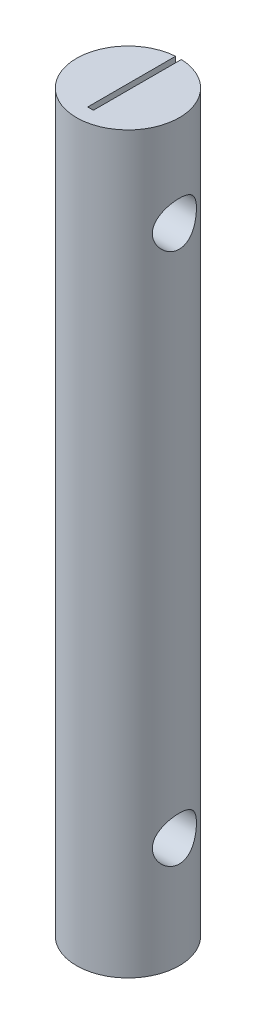
ISO-10303-21;
HEADER;
FILE_DESCRIPTION(('STEP AP214'),'2;1');
FILE_NAME('part.step','',(''),(''),'','','');
FILE_SCHEMA(('AUTOMOTIVE_DESIGN { 1 0 10303 214 1 1 1 1 }'));
ENDSEC;
DATA;
#1=APPLICATION_CONTEXT('core data for automotive mechanical design processes');
#2=APPLICATION_PROTOCOL_DEFINITION('international standard','automotive_design',2000,#1);
#3=PRODUCT_CONTEXT('',#1,'mechanical');
#4=PRODUCT('Part','Part','',(#3));
#5=PRODUCT_RELATED_PRODUCT_CATEGORY('part','',(#4));
#6=PRODUCT_DEFINITION_FORMATION('','',#4);
#7=PRODUCT_DEFINITION_CONTEXT('part definition',#1,'design');
#8=PRODUCT_DEFINITION('design','',#6,#7);
#9=PRODUCT_DEFINITION_SHAPE('','',#8);
#10=(LENGTH_UNIT() NAMED_UNIT(*) SI_UNIT(.MILLI.,.METRE.));
#11=(NAMED_UNIT(*) PLANE_ANGLE_UNIT() SI_UNIT($,.RADIAN.));
#12=(NAMED_UNIT(*) SI_UNIT($,.STERADIAN.) SOLID_ANGLE_UNIT());
#13=UNCERTAINTY_MEASURE_WITH_UNIT(LENGTH_MEASURE(1.E-05),#10,'distance_accuracy_value','');
#14=(GEOMETRIC_REPRESENTATION_CONTEXT(3) GLOBAL_UNCERTAINTY_ASSIGNED_CONTEXT((#13)) GLOBAL_UNIT_ASSIGNED_CONTEXT((#10,
#11,#12)) REPRESENTATION_CONTEXT('',''));
#15=CARTESIAN_POINT('',(0.,0.,0.));
#16=DIRECTION('',(0.,0.,1.));
#17=DIRECTION('',(1.,0.,0.));
#18=AXIS2_PLACEMENT_3D('',#15,#16,#17);
#19=CARTESIAN_POINT('',(0.,100.,0.));
#20=DIRECTION('',(0.,-1.,0.));
#21=DIRECTION('',(0.,0.,-1.));
#22=AXIS2_PLACEMENT_3D('',#19,#20,#21);
#23=CYLINDRICAL_SURFACE('',#22,7.);
#24=CARTESIAN_POINT('',(0.,100.,0.));
#25=DIRECTION('',(0.,1.,0.));
#26=DIRECTION('',(0.,0.,1.));
#27=AXIS2_PLACEMENT_3D('',#24,#25,#26);
#28=CIRCLE('',#27,7.);
#29=CARTESIAN_POINT('',(-0.499999999999999,100.,-6.98212002188447));
#30=VERTEX_POINT('',#29);
#31=CARTESIAN_POINT('',(0.27608075124194,100.,-6.99455355392992));
#32=VERTEX_POINT('',#31);
#33=EDGE_CURVE('E105',#30,#32,#28,.T.);
#34=ORIENTED_EDGE('',*,*,#33,.F.);
#35=DIRECTION('',(0.,-1.,0.));
#36=VECTOR('',#35,1.);
#37=CARTESIAN_POINT('',(-0.499999999999999,100.,-6.98212002188447));
#38=LINE('',#37,#36);
#39=CARTESIAN_POINT('',(-0.499999999999999,60.,-6.98212002188447));
#40=VERTEX_POINT('',#39);
#41=EDGE_CURVE('E102',#30,#40,#38,.T.);
#42=ORIENTED_EDGE('',*,*,#41,.T.);
#43=CARTESIAN_POINT('',(0.,60.,0.));
#44=DIRECTION('',(0.,1.,0.));
#45=DIRECTION('',(0.,0.,1.));
#46=AXIS2_PLACEMENT_3D('',#43,#44,#45);
#47=CIRCLE('',#46,7.);
#48=CARTESIAN_POINT('',(0.27608075124194,60.,-6.99455355392992));
#49=VERTEX_POINT('',#48);
#50=EDGE_CURVE('E11',#49,#40,#47,.T.);
#51=ORIENTED_EDGE('',*,*,#50,.F.);
#52=DIRECTION('',(0.,-1.,0.));
#53=VECTOR('',#52,1.);
#54=CARTESIAN_POINT('',(0.27608075124194,100.,-6.99455355392992));
#55=LINE('',#54,#53);
#56=EDGE_CURVE('E98',#49,#32,#55,.F.);
#57=ORIENTED_EDGE('',*,*,#56,.T.);
#58=EDGE_LOOP('',(#34,#42,#51,#57));
#59=FACE_BOUND('',#58,.T.);
#60=CARTESIAN_POINT('',(0.,0.,0.));
#61=DIRECTION('',(0.,1.,0.));
#62=DIRECTION('',(0.,0.,1.));
#63=AXIS2_PLACEMENT_3D('',#60,#61,#62);
#64=CIRCLE('',#63,7.);
#65=CARTESIAN_POINT('',(0.,0.,7.));
#66=VERTEX_POINT('',#65);
#67=EDGE_CURVE('E104',#66,#66,#64,.T.);
#68=ORIENTED_EDGE('',*,*,#67,.T.);
#69=EDGE_LOOP('',(#68));
#70=FACE_BOUND('',#69,.T.);
#71=CARTESIAN_POINT('',(-6.32326286388966,15.,3.00272322303504));
#72=CARTESIAN_POINT('',(-6.32326378315434,15.0797912896545,3.00272226818639));
#73=CARTESIAN_POINT('',(-6.32478146533273,15.1596118809787,2.99953311878725));
#74=CARTESIAN_POINT('',(-6.33079257859421,15.3186489963649,2.98682183299326));
#75=CARTESIAN_POINT('',(-6.33528790539103,15.3978651030629,2.97729566212505));
#76=CARTESIAN_POINT('',(-6.3530650917198,15.6340131467418,2.93928786779487));
#77=CARTESIAN_POINT('',(-6.37063756968942,15.7892250157486,2.90137729599567));
#78=CARTESIAN_POINT('',(-6.4148385436042,16.0897370264084,2.8022707548614));
#79=CARTESIAN_POINT('',(-6.44142856736231,16.2350761780639,2.74117357847268));
#80=CARTESIAN_POINT('',(-6.500603693556,16.5134371194853,2.59772153198398));
#81=CARTESIAN_POINT('',(-6.5331876198883,16.6464613179654,2.5153708309034));
#82=CARTESIAN_POINT('',(-6.60308877829957,16.9052311786623,2.32593830900264));
#83=CARTESIAN_POINT('',(-6.64057262682859,17.0300634835517,2.21767051747863));
#84=CARTESIAN_POINT('',(-6.71469078358872,17.2604816202512,1.98196508960753));
#85=CARTESIAN_POINT('',(-6.7513247470996,17.3660597575485,1.8545198263684));
#86=CARTESIAN_POINT('',(-6.82166586264291,17.5597335426098,1.57680138342897));
#87=CARTESIAN_POINT('',(-6.85515750379873,17.6467870960987,1.4257419236761));
#88=CARTESIAN_POINT('',(-6.91339082241381,17.7938478518043,1.10942612751776));
#89=CARTESIAN_POINT('',(-6.93813659272704,17.8538677087488,0.944176476898538));
#90=CARTESIAN_POINT('',(-6.97491347834318,17.9418124036036,0.61374680879481));
#91=CARTESIAN_POINT('',(-6.9875654805161,17.9713118175719,0.449056411400292));
#92=CARTESIAN_POINT('',(-7.00100203651558,18.0024770344066,0.116610327718632));
#93=CARTESIAN_POINT('',(-7.00179171329503,18.0041548525487,-0.0511440040136647));
#94=CARTESIAN_POINT('',(-6.99177277513283,17.9804249911638,-0.373428597075082));
#95=CARTESIAN_POINT('',(-6.98170819836005,17.956755554903,-0.528114471296276));
#96=CARTESIAN_POINT('',(-6.95215731198996,17.8859983254415,-0.831073500655528));
#97=CARTESIAN_POINT('',(-6.93267031115006,17.8389088141032,-0.979346184443139));
#98=CARTESIAN_POINT('',(-6.88577735894948,17.7221150794459,-1.26798767380358));
#99=CARTESIAN_POINT('',(-6.85825583387804,17.6520788364832,-1.40820257797709));
#100=CARTESIAN_POINT('',(-6.79796108187211,17.4917177145317,-1.67525969213018));
#101=CARTESIAN_POINT('',(-6.76518597214793,17.4013855571745,-1.80209708072876));
#102=CARTESIAN_POINT('',(-6.69479048985917,17.1952476046488,-2.04876226096162));
#103=CARTESIAN_POINT('',(-6.65699104415712,17.0780528434205,-2.16737980999052));
#104=CARTESIAN_POINT('',(-6.58259238611411,16.8254025458965,-2.38382119963024));
#105=CARTESIAN_POINT('',(-6.54599369712514,16.6899391752697,-2.4816360725643));
#106=CARTESIAN_POINT('',(-6.47682120801458,16.3983816856667,-2.65707048589437));
#107=CARTESIAN_POINT('',(-6.44444316942739,16.241714863924,-2.73382219709668));
#108=CARTESIAN_POINT('',(-6.38974480684829,15.9159286768116,-2.85935390433064));
#109=CARTESIAN_POINT('',(-6.36741683466148,15.7468188950728,-2.90815517863915));
#110=CARTESIAN_POINT('',(-6.3372798087362,15.4130765360986,-2.97322966393146));
#111=CARTESIAN_POINT('',(-6.32859493106654,15.2489083212291,-2.99147059646765));
#112=CARTESIAN_POINT('',(-6.32421968898995,14.9196619929362,-3.00071449565785));
#113=CARTESIAN_POINT('',(-6.32852438110462,14.7545842495233,-2.99172782439506));
#114=CARTESIAN_POINT('',(-6.34873302314869,14.4402859046611,-2.9485713391566));
#115=CARTESIAN_POINT('',(-6.3638118925518,14.2907595210896,-2.91619112946264));
#116=CARTESIAN_POINT('',(-6.40279141976494,13.999403516592,-2.82957599799855));
#117=CARTESIAN_POINT('',(-6.42669421850103,13.8575757731533,-2.77533577209872));
#118=CARTESIAN_POINT('',(-6.48188552590026,13.5787537793978,-2.64394242194293));
#119=CARTESIAN_POINT('',(-6.51344947941061,13.4422362094036,-2.56589729149866));
#120=CARTESIAN_POINT('',(-6.58003337440752,13.1835557673391,-2.38997869042985));
#121=CARTESIAN_POINT('',(-6.61505486533699,13.0613993852311,-2.29209630916704));
#122=CARTESIAN_POINT('',(-6.68827581588288,12.8238514691411,-2.06926631665099));
#123=CARTESIAN_POINT('',(-6.72648697354915,12.7099702661524,-1.94270591066993));
#124=CARTESIAN_POINT('',(-6.79897677450606,12.5047636212234,-1.67140952707088));
#125=CARTESIAN_POINT('',(-6.83325502815704,12.4134404131117,-1.52667175155937));
#126=CARTESIAN_POINT('',(-6.89432479209561,12.2558485112159,-1.22170095280638));
#127=CARTESIAN_POINT('',(-6.92107958727478,12.1897021465899,-1.06139690704243));
#128=CARTESIAN_POINT('',(-6.96377353791193,12.0858242717744,-0.73048863357864));
#129=CARTESIAN_POINT('',(-6.97971953966757,12.0480747733224,-0.559891000567304));
#130=CARTESIAN_POINT('',(-6.99817059776532,12.00441996817,-0.226711607260602));
#131=CARTESIAN_POINT('',(-7.00157374116683,11.996386761269,-0.0644566574853799));
#132=CARTESIAN_POINT('',(-6.997073869522,12.0065952376713,0.259046171665985));
#133=CARTESIAN_POINT('',(-6.9891730366938,12.0248318496243,0.420294239384294));
#134=CARTESIAN_POINT('',(-6.963434090249,12.0855369016493,0.730700780154835));
#135=CARTESIAN_POINT('',(-6.94599561815234,12.1270323913988,0.880085485827085));
#136=CARTESIAN_POINT('',(-6.90313487728844,12.2319824279208,1.1696912163942));
#137=CARTESIAN_POINT('',(-6.87771113609789,12.2954410247446,1.30991054549742));
#138=CARTESIAN_POINT('',(-6.81986821037176,12.4457391720343,1.58428371030018));
#139=CARTESIAN_POINT('',(-6.78718225099332,12.5335153780417,1.7178667771632));
#140=CARTESIAN_POINT('',(-6.71863505514397,12.7286336383767,1.96898810440127));
#141=CARTESIAN_POINT('',(-6.68277256320433,12.8359834467305,2.08651997375304));
#142=CARTESIAN_POINT('',(-6.60861837374977,13.0763507883284,2.31109260863649));
#143=CARTESIAN_POINT('',(-6.57033953914823,13.2106667101791,2.41675024864069));
#144=CARTESIAN_POINT('',(-6.49828904456149,13.4963533256694,2.60430013882765));
#145=CARTESIAN_POINT('',(-6.46452001206481,13.6477338675645,2.68617856717813));
#146=CARTESIAN_POINT('',(-6.42053526852075,13.8844307784929,2.7889251642932));
#147=CARTESIAN_POINT('',(-6.40698833087529,13.9649075867447,2.81982236673246));
#148=CARTESIAN_POINT('',(-6.38257011545701,14.1285759441178,2.87466573554698));
#149=CARTESIAN_POINT('',(-6.37169751453675,14.2117661276083,2.89861534035282));
#150=CARTESIAN_POINT('',(-6.35306374282358,14.3800043271867,2.93923109000154));
#151=CARTESIAN_POINT('',(-6.34529437526487,14.4650468148595,2.95591643304358));
#152=CARTESIAN_POINT('',(-6.33313829294579,14.6364516699032,2.9818731454383));
#153=CARTESIAN_POINT('',(-6.32874898440049,14.7228129732355,2.99115019995573));
#154=CARTESIAN_POINT('',(-6.32517996467578,14.8411445195379,2.99868324610555));
#155=CARTESIAN_POINT('',(-6.32446164184328,14.8728908029643,3.00019769857171));
#156=CARTESIAN_POINT('',(-6.32350290448429,14.9364231733768,3.00221788535343));
#157=CARTESIAN_POINT('',(-6.32326249763284,14.968209260994,3.00272360346935));
#158=CARTESIAN_POINT('',(-6.32326286388966,15.,3.00272322303504));
#159=B_SPLINE_CURVE_WITH_KNOTS('',3,(#71,#72,#73,#74,#75,#76,#77,#78,#79,#80,#81,#82,#83,#84,
#85,#86,#87,#88,#89,#90,#91,#92,#93,#94,#95,#96,#97,#98,#99,#100,#101,#102,#103,#104,#105,#106,
#107,#108,#109,#110,#111,#112,#113,#114,#115,#116,#117,#118,#119,#120,#121,#122,#123,#124,#125,
#126,#127,#128,#129,#130,#131,#132,#133,#134,#135,#136,#137,#138,#139,#140,#141,#142,#143,#144,
#145,#146,#147,#148,#149,#150,#151,#152,#153,#154,#155,#156,#157,#158),.UNSPECIFIED.,.T.,.F.,(4,
2,2,2,2,2,2,2,2,2,2,2,2,2,2,2,2,2,2,2,2,2,2,2,2,2,2,2,2,2,2,2,2,2,2,2,2,2,2,2,2,2,2,4),(0.,
0.239338244887283,0.478829010811593,0.958460945018812,1.43607181036892,1.91358906030128,
2.4197112565315,2.92603527246616,3.45591952851075,3.98555548229669,4.48625015142358,
4.98672858057274,5.45495951464113,5.92322480401723,6.39858906115766,6.87412406271998,
7.38479275075876,7.89568113508067,8.42522415338773,8.95436350031238,9.44789955511443,
9.94124780715423,10.4003836153743,10.8596308957659,11.3388032299623,11.8181912811821,
12.3392379542931,12.8603362039152,13.3839349896902,13.9072018169267,14.3921818903264,
14.8770683515757,15.3430410061853,15.8090996331255,16.2964751312754,16.7840441229666,
17.3070458065871,17.8303508829182,18.0918408955747,18.3532012727434,18.6138666631023,
18.8743318245369,18.9696883167252,19.0650463402678),.UNSPECIFIED.);
#160=CARTESIAN_POINT('',(-6.32326286388966,15.,3.00272322303504));
#161=VERTEX_POINT('',#160);
#162=EDGE_CURVE('E111',#161,#161,#159,.T.);
#163=ORIENTED_EDGE('',*,*,#162,.F.);
#164=EDGE_LOOP('',(#163));
#165=FACE_BOUND('',#164,.T.);
#166=CARTESIAN_POINT('',(6.32326286388966,15.,3.00272322303504));
#167=CARTESIAN_POINT('',(6.32326378315434,14.9202087103455,3.00272226818639));
#168=CARTESIAN_POINT('',(6.32478146533273,14.8403881190213,2.99953311878725));
#169=CARTESIAN_POINT('',(6.33079257859421,14.6813510036351,2.98682183299326));
#170=CARTESIAN_POINT('',(6.33528790539103,14.6021348969371,2.97729566212505));
#171=CARTESIAN_POINT('',(6.3530650917198,14.3659868532581,2.93928786779487));
#172=CARTESIAN_POINT('',(6.37063756968942,14.2107749842514,2.90137729599567));
#173=CARTESIAN_POINT('',(6.4148385436042,13.9102629735916,2.8022707548614));
#174=CARTESIAN_POINT('',(6.44142856736231,13.764923821936,2.74117357847268));
#175=CARTESIAN_POINT('',(6.500603693556,13.4865628805147,2.59772153198398));
#176=CARTESIAN_POINT('',(6.5331876198883,13.3535386820346,2.5153708309034));
#177=CARTESIAN_POINT('',(6.60308877829957,13.0947688213377,2.32593830900264));
#178=CARTESIAN_POINT('',(6.64057262682859,12.9699365164483,2.21767051747863));
#179=CARTESIAN_POINT('',(6.71469078358872,12.7395183797488,1.98196508960753));
#180=CARTESIAN_POINT('',(6.7513247470996,12.6339402424515,1.8545198263684));
#181=CARTESIAN_POINT('',(6.82166586264291,12.4402664573902,1.57680138342897));
#182=CARTESIAN_POINT('',(6.85515750379873,12.3532129039013,1.4257419236761));
#183=CARTESIAN_POINT('',(6.91339082241381,12.2061521481957,1.10942612751776));
#184=CARTESIAN_POINT('',(6.93813659272704,12.1461322912512,0.944176476898537));
#185=CARTESIAN_POINT('',(6.97491347834318,12.0581875963964,0.613746808794809));
#186=CARTESIAN_POINT('',(6.9875654805161,12.0286881824281,0.449056411400291));
#187=CARTESIAN_POINT('',(7.00100203651558,11.9975229655934,0.116610327718632));
#188=CARTESIAN_POINT('',(7.00179171329503,11.9958451474513,-0.051144004013664));
#189=CARTESIAN_POINT('',(6.99177277513283,12.0195750088362,-0.373428597075081));
#190=CARTESIAN_POINT('',(6.98170819836005,12.043244445097,-0.528114471296275));
#191=CARTESIAN_POINT('',(6.95215731198996,12.1140016745585,-0.831073500655528));
#192=CARTESIAN_POINT('',(6.93267031115006,12.1610911858968,-0.979346184443139));
#193=CARTESIAN_POINT('',(6.88577735894948,12.2778849205541,-1.26798767380358));
#194=CARTESIAN_POINT('',(6.85825583387804,12.3479211635168,-1.40820257797709));
#195=CARTESIAN_POINT('',(6.79796108187211,12.5082822854683,-1.67525969213018));
#196=CARTESIAN_POINT('',(6.76518597214793,12.5986144428255,-1.80209708072876));
#197=CARTESIAN_POINT('',(6.69479048985917,12.8047523953512,-2.04876226096162));
#198=CARTESIAN_POINT('',(6.65699104415712,12.9219471565795,-2.16737980999052));
#199=CARTESIAN_POINT('',(6.58259238611411,13.1745974541035,-2.38382119963024));
#200=CARTESIAN_POINT('',(6.54599369712514,13.3100608247303,-2.4816360725643));
#201=CARTESIAN_POINT('',(6.47682120801458,13.6016183143333,-2.65707048589437));
#202=CARTESIAN_POINT('',(6.44444316942739,13.758285136076,-2.73382219709669));
#203=CARTESIAN_POINT('',(6.38974480684829,14.0840713231884,-2.85935390433064));
#204=CARTESIAN_POINT('',(6.36741683466148,14.2531811049272,-2.90815517863915));
#205=CARTESIAN_POINT('',(6.3372798087362,14.5869234639014,-2.97322966393146));
#206=CARTESIAN_POINT('',(6.32859493106654,14.7510916787709,-2.99147059646765));
#207=CARTESIAN_POINT('',(6.32421968898995,15.0803380070638,-3.00071449565785));
#208=CARTESIAN_POINT('',(6.32852438110462,15.2454157504767,-2.99172782439506));
#209=CARTESIAN_POINT('',(6.34873302314869,15.5597140953389,-2.9485713391566));
#210=CARTESIAN_POINT('',(6.3638118925518,15.7092404789104,-2.91619112946264));
#211=CARTESIAN_POINT('',(6.40279141976494,16.0005964834079,-2.82957599799855));
#212=CARTESIAN_POINT('',(6.42669421850103,16.1424242268467,-2.77533577209872));
#213=CARTESIAN_POINT('',(6.48188552590026,16.4212462206022,-2.64394242194293));
#214=CARTESIAN_POINT('',(6.51344947941061,16.5577637905964,-2.56589729149866));
#215=CARTESIAN_POINT('',(6.58003337440752,16.8164442326609,-2.38997869042984));
#216=CARTESIAN_POINT('',(6.61505486533699,16.9386006147689,-2.29209630916704));
#217=CARTESIAN_POINT('',(6.68827581588288,17.1761485308589,-2.06926631665099));
#218=CARTESIAN_POINT('',(6.72648697354915,17.2900297338476,-1.94270591066993));
#219=CARTESIAN_POINT('',(6.79897677450606,17.4952363787766,-1.67140952707088));
#220=CARTESIAN_POINT('',(6.83325502815704,17.5865595868883,-1.52667175155937));
#221=CARTESIAN_POINT('',(6.89432479209561,17.7441514887841,-1.22170095280638));
#222=CARTESIAN_POINT('',(6.92107958727478,17.8102978534101,-1.06139690704243));
#223=CARTESIAN_POINT('',(6.96377353791193,17.9141757282256,-0.73048863357864));
#224=CARTESIAN_POINT('',(6.97971953966757,17.9519252266776,-0.559891000567304));
#225=CARTESIAN_POINT('',(6.99817059776532,17.99558003183,-0.226711607260602));
#226=CARTESIAN_POINT('',(7.00157374116683,18.003613238731,-0.0644566574853802));
#227=CARTESIAN_POINT('',(6.997073869522,17.9934047623287,0.259046171665984));
#228=CARTESIAN_POINT('',(6.9891730366938,17.9751681503757,0.420294239384293));
#229=CARTESIAN_POINT('',(6.963434090249,17.9144630983507,0.730700780154835));
#230=CARTESIAN_POINT('',(6.94599561815234,17.8729676086012,0.880085485827085));
#231=CARTESIAN_POINT('',(6.90313487728844,17.7680175720792,1.1696912163942));
#232=CARTESIAN_POINT('',(6.87771113609789,17.7045589752554,1.30991054549742));
#233=CARTESIAN_POINT('',(6.81986821037176,17.5542608279657,1.58428371030018));
#234=CARTESIAN_POINT('',(6.78718225099332,17.4664846219583,1.7178667771632));
#235=CARTESIAN_POINT('',(6.71863505514397,17.2713663616233,1.96898810440127));
#236=CARTESIAN_POINT('',(6.68277256320433,17.1640165532695,2.08651997375304));
#237=CARTESIAN_POINT('',(6.60861837374977,16.9236492116716,2.31109260863649));
#238=CARTESIAN_POINT('',(6.57033953914823,16.7893332898209,2.41675024864069));
#239=CARTESIAN_POINT('',(6.4982890445615,16.5036466743306,2.60430013882765));
#240=CARTESIAN_POINT('',(6.46452001206481,16.3522661324355,2.68617856717813));
#241=CARTESIAN_POINT('',(6.42053526852075,16.1155692215071,2.7889251642932));
#242=CARTESIAN_POINT('',(6.40698833087529,16.0350924132553,2.81982236673246));
#243=CARTESIAN_POINT('',(6.38257011545701,15.8714240558822,2.87466573554698));
#244=CARTESIAN_POINT('',(6.37169751453675,15.7882338723917,2.89861534035282));
#245=CARTESIAN_POINT('',(6.35306374282358,15.6199956728133,2.93923109000154));
#246=CARTESIAN_POINT('',(6.34529437526487,15.5349531851405,2.95591643304358));
#247=CARTESIAN_POINT('',(6.33313829294579,15.3635483300968,2.9818731454383));
#248=CARTESIAN_POINT('',(6.32874898440049,15.2771870267645,2.99115019995573));
#249=CARTESIAN_POINT('',(6.32517996467578,15.1588554804621,2.99868324610555));
#250=CARTESIAN_POINT('',(6.32446164184328,15.1271091970357,3.00019769857171));
#251=CARTESIAN_POINT('',(6.32350290448429,15.0635768266232,3.00221788535343));
#252=CARTESIAN_POINT('',(6.32326249763284,15.031790739006,3.00272360346935));
#253=CARTESIAN_POINT('',(6.32326286388966,15.,3.00272322303504));
#254=B_SPLINE_CURVE_WITH_KNOTS('',3,(#166,#167,#168,#169,#170,#171,#172,#173,#174,#175,#176,
#177,#178,#179,#180,#181,#182,#183,#184,#185,#186,#187,#188,#189,#190,#191,#192,#193,#194,#195,
#196,#197,#198,#199,#200,#201,#202,#203,#204,#205,#206,#207,#208,#209,#210,#211,#212,#213,#214,
#215,#216,#217,#218,#219,#220,#221,#222,#223,#224,#225,#226,#227,#228,#229,#230,#231,#232,#233,
#234,#235,#236,#237,#238,#239,#240,#241,#242,#243,#244,#245,#246,#247,#248,#249,#250,#251,#252,
#253),.UNSPECIFIED.,.T.,.F.,(4,2,2,2,2,2,2,2,2,2,2,2,2,2,2,2,2,2,2,2,2,2,2,2,2,2,2,2,2,2,2,2,2,
2,2,2,2,2,2,2,2,2,2,4),(0.,0.239338244887283,0.478829010811593,0.958460945018812,
1.43607181036892,1.91358906030127,2.4197112565315,2.92603527246616,3.45591952851075,
3.98555548229669,4.48625015142358,4.98672858057274,5.45495951464113,5.92322480401723,
6.39858906115766,6.87412406271998,7.38479275075876,7.89568113508067,8.42522415338774,
8.95436350031238,9.44789955511443,9.94124780715423,10.4003836153743,10.8596308957659,
11.3388032299623,11.8181912811821,12.3392379542931,12.8603362039152,13.3839349896902,
13.9072018169267,14.3921818903264,14.8770683515757,15.3430410061853,15.8090996331255,
16.2964751312754,16.7840441229666,17.3070458065871,17.8303508829182,18.0918408955747,
18.3532012727434,18.6138666631023,18.8743318245369,18.9696883167252,19.0650463402678),.UNSPECIFIED.);
#255=CARTESIAN_POINT('',(6.32326286388966,15.,3.00272322303504));
#256=VERTEX_POINT('',#255);
#257=EDGE_CURVE('E96',#256,#256,#254,.T.);
#258=ORIENTED_EDGE('',*,*,#257,.F.);
#259=EDGE_LOOP('',(#258));
#260=FACE_BOUND('',#259,.T.);
#261=CARTESIAN_POINT('',(-6.32326286388966,87.4957498254206,3.00272322303504));
#262=CARTESIAN_POINT('',(-6.32326378315434,87.5755411150751,3.00272226818639));
#263=CARTESIAN_POINT('',(-6.32478146533273,87.6553617063993,2.99953311878725));
#264=CARTESIAN_POINT('',(-6.33079257859421,87.8143988217855,2.98682183299326));
#265=CARTESIAN_POINT('',(-6.33528790539103,87.8936149284835,2.97729566212505));
#266=CARTESIAN_POINT('',(-6.3530650917198,88.1297629721625,2.93928786779487));
#267=CARTESIAN_POINT('',(-6.37063756968942,88.2849748411692,2.90137729599567));
#268=CARTESIAN_POINT('',(-6.4148385436042,88.5854868518289,2.8022707548614));
#269=CARTESIAN_POINT('',(-6.44142856736231,88.7308260034845,2.74117357847269));
#270=CARTESIAN_POINT('',(-6.50060369355599,89.0091869449059,2.59772153198399));
#271=CARTESIAN_POINT('',(-6.5331876198883,89.142211143386,2.51537083090341));
#272=CARTESIAN_POINT('',(-6.60308877829957,89.4009810040829,2.32593830900265));
#273=CARTESIAN_POINT('',(-6.64057262682859,89.5258133089723,2.21767051747864));
#274=CARTESIAN_POINT('',(-6.71469078358872,89.7562314456718,1.98196508960753));
#275=CARTESIAN_POINT('',(-6.7513247470996,89.8618095829691,1.8545198263684));
#276=CARTESIAN_POINT('',(-6.82166586264291,90.0554833680304,1.57680138342897));
#277=CARTESIAN_POINT('',(-6.85515750379873,90.1425369215193,1.42574192367609));
#278=CARTESIAN_POINT('',(-6.91339082241381,90.2895976772248,1.10942612751775));
#279=CARTESIAN_POINT('',(-6.93813659272704,90.3496175341694,0.944176476898533));
#280=CARTESIAN_POINT('',(-6.97491347834318,90.4375622290242,0.613746808794807));
#281=CARTESIAN_POINT('',(-6.9875654805161,90.4670616429925,0.44905641140029));
#282=CARTESIAN_POINT('',(-7.00100203651558,90.4982268598272,0.116610327718631));
#283=CARTESIAN_POINT('',(-7.00179171329503,90.4999046779692,-0.051144004013666));
#284=CARTESIAN_POINT('',(-6.99177277513283,90.4761748165844,-0.373428597075082));
#285=CARTESIAN_POINT('',(-6.98170819836004,90.4525053803236,-0.528114471296276));
#286=CARTESIAN_POINT('',(-6.95215731198996,90.3817481508621,-0.831073500655528));
#287=CARTESIAN_POINT('',(-6.93267031115006,90.3346586395238,-0.97934618444314));
#288=CARTESIAN_POINT('',(-6.88577735894948,90.2178649048665,-1.26798767380358));
#289=CARTESIAN_POINT('',(-6.85825583387804,90.1478286619038,-1.40820257797709));
#290=CARTESIAN_POINT('',(-6.79796108187211,89.9874675399523,-1.67525969213018));
#291=CARTESIAN_POINT('',(-6.76518597214793,89.897135382595,-1.80209708072877));
#292=CARTESIAN_POINT('',(-6.69479048985917,89.6909974300694,-2.04876226096163));
#293=CARTESIAN_POINT('',(-6.65699104415712,89.5738026688411,-2.16737980999052));
#294=CARTESIAN_POINT('',(-6.58259238611411,89.3211523713171,-2.38382119963024));
#295=CARTESIAN_POINT('',(-6.54599369712514,89.1856890006902,-2.4816360725643));
#296=CARTESIAN_POINT('',(-6.47682120801458,88.8941315110873,-2.65707048589437));
#297=CARTESIAN_POINT('',(-6.44444316942739,88.7374646893446,-2.73382219709669));
#298=CARTESIAN_POINT('',(-6.38974480684829,88.4116785022321,-2.85935390433064));
#299=CARTESIAN_POINT('',(-6.36741683466148,88.2425687204934,-2.90815517863915));
#300=CARTESIAN_POINT('',(-6.3372798087362,87.9088263615192,-2.97322966393146));
#301=CARTESIAN_POINT('',(-6.32859493106654,87.7446581466497,-2.99147059646765));
#302=CARTESIAN_POINT('',(-6.32421968898995,87.4154118183568,-3.00071449565785));
#303=CARTESIAN_POINT('',(-6.32852438110462,87.250334074944,-2.99172782439506));
#304=CARTESIAN_POINT('',(-6.34873302314869,86.9360357300818,-2.9485713391566));
#305=CARTESIAN_POINT('',(-6.3638118925518,86.7865093465102,-2.91619112946264));
#306=CARTESIAN_POINT('',(-6.40279141976494,86.4951533420126,-2.82957599799856));
#307=CARTESIAN_POINT('',(-6.42669421850103,86.3533255985739,-2.77533577209873));
#308=CARTESIAN_POINT('',(-6.48188552590026,86.0745036048184,-2.64394242194293));
#309=CARTESIAN_POINT('',(-6.5134494794106,85.9379860348242,-2.56589729149866));
#310=CARTESIAN_POINT('',(-6.58003337440752,85.6793055927597,-2.38997869042985));
#311=CARTESIAN_POINT('',(-6.61505486533699,85.5571492106517,-2.29209630916704));
#312=CARTESIAN_POINT('',(-6.68827581588288,85.3196012945617,-2.06926631665099));
#313=CARTESIAN_POINT('',(-6.72648697354915,85.205720091573,-1.94270591066993));
#314=CARTESIAN_POINT('',(-6.79897677450606,85.000513446644,-1.67140952707088));
#315=CARTESIAN_POINT('',(-6.83325502815703,84.9091902385322,-1.52667175155937));
#316=CARTESIAN_POINT('',(-6.89432479209561,84.7515983366365,-1.22170095280638));
#317=CARTESIAN_POINT('',(-6.92107958727478,84.6854519720105,-1.06139690704243));
#318=CARTESIAN_POINT('',(-6.96377353791193,84.581574097195,-0.730488633578635));
#319=CARTESIAN_POINT('',(-6.97971953966757,84.543824598743,-0.5598910005673));
#320=CARTESIAN_POINT('',(-6.99817059776532,84.5001697935906,-0.226711607260598));
#321=CARTESIAN_POINT('',(-7.00157374116683,84.4921365866896,-0.0644566574853764));
#322=CARTESIAN_POINT('',(-6.997073869522,84.5023450630919,0.259046171665987));
#323=CARTESIAN_POINT('',(-6.9891730366938,84.5205816750449,0.420294239384295));
#324=CARTESIAN_POINT('',(-6.963434090249,84.5812867270699,0.730700780154834));
#325=CARTESIAN_POINT('',(-6.94599561815234,84.6227822168194,0.880085485827084));
#326=CARTESIAN_POINT('',(-6.90313487728844,84.7277322533414,1.16969121639419));
#327=CARTESIAN_POINT('',(-6.87771113609789,84.7911908501652,1.30991054549742));
#328=CARTESIAN_POINT('',(-6.81986821037176,84.9414889974549,1.58428371030018));
#329=CARTESIAN_POINT('',(-6.78718225099332,85.0292652034623,1.7178667771632));
#330=CARTESIAN_POINT('',(-6.71863505514397,85.2243834637973,1.96898810440128));
#331=CARTESIAN_POINT('',(-6.68277256320433,85.3317332721511,2.08651997375304));
#332=CARTESIAN_POINT('',(-6.60861837374977,85.572100613749,2.31109260863649));
#333=CARTESIAN_POINT('',(-6.57033953914823,85.7064165355997,2.41675024864069));
#334=CARTESIAN_POINT('',(-6.4982890445615,85.99210315109,2.60430013882764));
#335=CARTESIAN_POINT('',(-6.46452001206481,86.1434836929851,2.68617856717813));
#336=CARTESIAN_POINT('',(-6.42053526852075,86.3801806039135,2.7889251642932));
#337=CARTESIAN_POINT('',(-6.40698833087529,86.4606574121653,2.81982236673247));
#338=CARTESIAN_POINT('',(-6.38257011545701,86.6243257695383,2.87466573554698));
#339=CARTESIAN_POINT('',(-6.37169751453675,86.7075159530289,2.89861534035282));
#340=CARTESIAN_POINT('',(-6.35306374282358,86.8757541526073,2.93923109000154));
#341=CARTESIAN_POINT('',(-6.34529437526487,86.9607966402801,2.95591643304358));
#342=CARTESIAN_POINT('',(-6.33313829294579,87.1322014953238,2.9818731454383));
#343=CARTESIAN_POINT('',(-6.32874898440049,87.2185627986561,2.99115019995574));
#344=CARTESIAN_POINT('',(-6.32517996467578,87.3368943449585,2.99868324610555));
#345=CARTESIAN_POINT('',(-6.32446164184328,87.3686406283849,3.00019769857171));
#346=CARTESIAN_POINT('',(-6.32350290448429,87.4321729987974,3.00221788535343));
#347=CARTESIAN_POINT('',(-6.32326249763284,87.4639590864146,3.00272360346935));
#348=CARTESIAN_POINT('',(-6.32326286388966,87.4957498254206,3.00272322303504));
#349=B_SPLINE_CURVE_WITH_KNOTS('',3,(#261,#262,#263,#264,#265,#266,#267,#268,#269,#270,#271,
#272,#273,#274,#275,#276,#277,#278,#279,#280,#281,#282,#283,#284,#285,#286,#287,#288,#289,#290,
#291,#292,#293,#294,#295,#296,#297,#298,#299,#300,#301,#302,#303,#304,#305,#306,#307,#308,#309,
#310,#311,#312,#313,#314,#315,#316,#317,#318,#319,#320,#321,#322,#323,#324,#325,#326,#327,#328,
#329,#330,#331,#332,#333,#334,#335,#336,#337,#338,#339,#340,#341,#342,#343,#344,#345,#346,#347,
#348),.UNSPECIFIED.,.T.,.F.,(4,2,2,2,2,2,2,2,2,2,2,2,2,2,2,2,2,2,2,2,2,2,2,2,2,2,2,2,2,2,2,2,2,
2,2,2,2,2,2,2,2,2,2,4),(0.,0.239338244887285,0.478829010811606,0.958460945018816,
1.4360718103689,1.91358906030127,2.41971125653149,2.92603527246617,3.45591952851076,
3.98555548229669,4.48625015142358,4.98672858057275,5.45495951464113,5.92322480401723,
6.39858906115766,6.87412406271999,7.38479275075876,7.89568113508068,8.42522415338775,
8.95436350031239,9.44789955511442,9.94124780715422,10.4003836153742,10.8596308957659,
11.3388032299623,11.8181912811821,12.3392379542931,12.8603362039152,13.3839349896902,
13.9072018169267,14.3921818903264,14.8770683515757,15.3430410061853,15.8090996331255,
16.2964751312754,16.7840441229666,17.3070458065871,17.8303508829182,18.0918408955747,
18.3532012727435,18.6138666631023,18.8743318245369,18.9696883167252,19.0650463402678),.UNSPECIFIED.);
#350=CARTESIAN_POINT('',(-6.32326286388966,87.4957498254206,3.00272322303504));
#351=VERTEX_POINT('',#350);
#352=EDGE_CURVE('E163',#351,#351,#349,.T.);
#353=ORIENTED_EDGE('',*,*,#352,.F.);
#354=EDGE_LOOP('',(#353));
#355=FACE_BOUND('',#354,.T.);
#356=CARTESIAN_POINT('',(6.32326286388966,87.4957498254206,3.00272322303504));
#357=CARTESIAN_POINT('',(6.32326378315434,87.4159585357661,3.00272226818639));
#358=CARTESIAN_POINT('',(6.32478146533273,87.3361379444419,2.99953311878725));
#359=CARTESIAN_POINT('',(6.33079257859421,87.1771008290557,2.98682183299326));
#360=CARTESIAN_POINT('',(6.33528790539103,87.0978847223577,2.97729566212505));
#361=CARTESIAN_POINT('',(6.3530650917198,86.8617366786788,2.93928786779487));
#362=CARTESIAN_POINT('',(6.37063756968942,86.706524809672,2.90137729599567));
#363=CARTESIAN_POINT('',(6.4148385436042,86.4060127990122,2.8022707548614));
#364=CARTESIAN_POINT('',(6.44142856736231,86.2606736473566,2.74117357847268));
#365=CARTESIAN_POINT('',(6.500603693556,85.9823127059352,2.59772153198398));
#366=CARTESIAN_POINT('',(6.5331876198883,85.8492885074552,2.51537083090341));
#367=CARTESIAN_POINT('',(6.60308877829957,85.5905186467583,2.32593830900265));
#368=CARTESIAN_POINT('',(6.64057262682859,85.4656863418689,2.21767051747864));
#369=CARTESIAN_POINT('',(6.71469078358872,85.2352682051694,1.98196508960753));
#370=CARTESIAN_POINT('',(6.7513247470996,85.1296900678721,1.8545198263684));
#371=CARTESIAN_POINT('',(6.82166586264291,84.9360162828108,1.57680138342897));
#372=CARTESIAN_POINT('',(6.85515750379873,84.8489627293219,1.42574192367609));
#373=CARTESIAN_POINT('',(6.91339082241381,84.7019019736163,1.10942612751775));
#374=CARTESIAN_POINT('',(6.93813659272704,84.6418821166718,0.944176476898533));
#375=CARTESIAN_POINT('',(6.97491347834318,84.553937421817,0.613746808794807));
#376=CARTESIAN_POINT('',(6.9875654805161,84.5244380078486,0.44905641140029));
#377=CARTESIAN_POINT('',(7.00100203651558,84.493272791014,0.116610327718631));
#378=CARTESIAN_POINT('',(7.00179171329503,84.4915949728719,-0.0511440040136659));
#379=CARTESIAN_POINT('',(6.99177277513283,84.5153248342568,-0.373428597075082));
#380=CARTESIAN_POINT('',(6.98170819836004,84.5389942705176,-0.528114471296276));
#381=CARTESIAN_POINT('',(6.95215731198996,84.6097514999791,-0.831073500655528));
#382=CARTESIAN_POINT('',(6.93267031115006,84.6568410113174,-0.97934618444314));
#383=CARTESIAN_POINT('',(6.88577735894948,84.7736347459747,-1.26798767380358));
#384=CARTESIAN_POINT('',(6.85825583387804,84.8436709889373,-1.4082025779771));
#385=CARTESIAN_POINT('',(6.79796108187211,85.0040321108889,-1.67525969213019));
#386=CARTESIAN_POINT('',(6.76518597214793,85.0943642682461,-1.80209708072877));
#387=CARTESIAN_POINT('',(6.69479048985917,85.3005022207718,-2.04876226096163));
#388=CARTESIAN_POINT('',(6.65699104415711,85.4176969820001,-2.16737980999052));
#389=CARTESIAN_POINT('',(6.58259238611411,85.6703472795241,-2.38382119963024));
#390=CARTESIAN_POINT('',(6.54599369712514,85.8058106501509,-2.4816360725643));
#391=CARTESIAN_POINT('',(6.47682120801458,86.0973681397539,-2.65707048589438));
#392=CARTESIAN_POINT('',(6.44444316942738,86.2540349614966,-2.7338221970967));
#393=CARTESIAN_POINT('',(6.38974480684828,86.5798211486091,-2.85935390433065));
#394=CARTESIAN_POINT('',(6.36741683466148,86.7489309303478,-2.90815517863915));
#395=CARTESIAN_POINT('',(6.3372798087362,87.082673289322,-2.97322966393146));
#396=CARTESIAN_POINT('',(6.32859493106654,87.2468415041915,-2.99147059646765));
#397=CARTESIAN_POINT('',(6.32421968898995,87.5760878324844,-3.00071449565785));
#398=CARTESIAN_POINT('',(6.32852438110462,87.7411655758972,-2.99172782439506));
#399=CARTESIAN_POINT('',(6.34873302314869,88.0554639207594,-2.9485713391566));
#400=CARTESIAN_POINT('',(6.3638118925518,88.204990304331,-2.91619112946264));
#401=CARTESIAN_POINT('',(6.40279141976494,88.4963463088285,-2.82957599799856));
#402=CARTESIAN_POINT('',(6.42669421850103,88.6381740522673,-2.77533577209872));
#403=CARTESIAN_POINT('',(6.48188552590026,88.9169960460228,-2.64394242194293));
#404=CARTESIAN_POINT('',(6.5134494794106,89.053513616017,-2.56589729149866));
#405=CARTESIAN_POINT('',(6.58003337440752,89.3121940580815,-2.38997869042985));
#406=CARTESIAN_POINT('',(6.61505486533699,89.4343504401895,-2.29209630916704));
#407=CARTESIAN_POINT('',(6.68827581588288,89.6718983562795,-2.06926631665099));
#408=CARTESIAN_POINT('',(6.72648697354915,89.7857795592682,-1.94270591066993));
#409=CARTESIAN_POINT('',(6.79897677450606,89.9909862041972,-1.67140952707088));
#410=CARTESIAN_POINT('',(6.83325502815703,90.0823094123089,-1.52667175155937));
#411=CARTESIAN_POINT('',(6.89432479209561,90.2399013142047,-1.22170095280639));
#412=CARTESIAN_POINT('',(6.92107958727478,90.3060476788307,-1.06139690704243));
#413=CARTESIAN_POINT('',(6.96377353791193,90.4099255536462,-0.730488633578638));
#414=CARTESIAN_POINT('',(6.97971953966757,90.4476750520982,-0.559891000567301));
#415=CARTESIAN_POINT('',(6.99817059776532,90.4913298572506,-0.226711607260598));
#416=CARTESIAN_POINT('',(7.00157374116683,90.4993630641516,-0.0644566574853763));
#417=CARTESIAN_POINT('',(6.997073869522,90.4891545877493,0.259046171665987));
#418=CARTESIAN_POINT('',(6.9891730366938,90.4709179757963,0.420294239384294));
#419=CARTESIAN_POINT('',(6.963434090249,90.4102129237713,0.730700780154836));
#420=CARTESIAN_POINT('',(6.94599561815234,90.3687174340218,0.880085485827087));
#421=CARTESIAN_POINT('',(6.90313487728844,90.2637673974997,1.1696912163942));
#422=CARTESIAN_POINT('',(6.87771113609789,90.200308800676,1.30991054549743));
#423=CARTESIAN_POINT('',(6.81986821037176,90.0500106533863,1.58428371030018));
#424=CARTESIAN_POINT('',(6.78718225099332,89.9622344473789,1.7178667771632));
#425=CARTESIAN_POINT('',(6.71863505514397,89.7671161870439,1.96898810440128));
#426=CARTESIAN_POINT('',(6.68277256320433,89.6597663786901,2.08651997375304));
#427=CARTESIAN_POINT('',(6.60861837374977,89.4193990370922,2.31109260863649));
#428=CARTESIAN_POINT('',(6.57033953914823,89.2850831152415,2.41675024864069));
#429=CARTESIAN_POINT('',(6.4982890445615,88.9993964997512,2.60430013882764));
#430=CARTESIAN_POINT('',(6.46452001206481,88.8480159578561,2.68617856717813));
#431=CARTESIAN_POINT('',(6.42053526852075,88.6113190469277,2.7889251642932));
#432=CARTESIAN_POINT('',(6.40698833087529,88.5308422386759,2.81982236673246));
#433=CARTESIAN_POINT('',(6.38257011545701,88.3671738813028,2.87466573554698));
#434=CARTESIAN_POINT('',(6.37169751453675,88.2839836978123,2.89861534035282));
#435=CARTESIAN_POINT('',(6.35306374282358,88.1157454982339,2.93923109000154));
#436=CARTESIAN_POINT('',(6.34529437526487,88.0307030105611,2.95591643304358));
#437=CARTESIAN_POINT('',(6.33313829294579,87.8592981555174,2.9818731454383));
#438=CARTESIAN_POINT('',(6.32874898440049,87.7729368521851,2.99115019995574));
#439=CARTESIAN_POINT('',(6.32517996467578,87.6546053058827,2.99868324610555));
#440=CARTESIAN_POINT('',(6.32446164184328,87.6228590224563,3.00019769857171));
#441=CARTESIAN_POINT('',(6.32350290448429,87.5593266520438,3.00221788535343));
#442=CARTESIAN_POINT('',(6.32326249763284,87.5275405644266,3.00272360346935));
#443=CARTESIAN_POINT('',(6.32326286388966,87.4957498254206,3.00272322303504));
#444=B_SPLINE_CURVE_WITH_KNOTS('',3,(#356,#357,#358,#359,#360,#361,#362,#363,#364,#365,#366,
#367,#368,#369,#370,#371,#372,#373,#374,#375,#376,#377,#378,#379,#380,#381,#382,#383,#384,#385,
#386,#387,#388,#389,#390,#391,#392,#393,#394,#395,#396,#397,#398,#399,#400,#401,#402,#403,#404,
#405,#406,#407,#408,#409,#410,#411,#412,#413,#414,#415,#416,#417,#418,#419,#420,#421,#422,#423,
#424,#425,#426,#427,#428,#429,#430,#431,#432,#433,#434,#435,#436,#437,#438,#439,#440,#441,#442,
#443),.UNSPECIFIED.,.T.,.F.,(4,2,2,2,2,2,2,2,2,2,2,2,2,2,2,2,2,2,2,2,2,2,2,2,2,2,2,2,2,2,2,2,2,
2,2,2,2,2,2,2,2,2,2,4),(0.,0.239338244887285,0.478829010811592,0.958460945018816,
1.43607181036893,1.91358906030127,2.41971125653149,2.92603527246617,3.45591952851076,
3.98555548229669,4.48625015142358,4.98672858057275,5.45495951464113,5.92322480401724,
6.39858906115767,6.87412406271999,7.38479275075876,7.89568113508068,8.42522415338777,
8.95436350031239,9.44789955511445,9.94124780715422,10.4003836153743,10.8596308957659,
11.3388032299623,11.8181912811821,12.3392379542931,12.8603362039152,13.3839349896902,
13.9072018169267,14.3921818903264,14.8770683515757,15.3430410061853,15.8090996331255,
16.2964751312754,16.7840441229666,17.3070458065871,17.8303508829182,18.0918408955747,
18.3532012727435,18.6138666631023,18.8743318245369,18.9696883167252,19.0650463402678),.UNSPECIFIED.);
#445=CARTESIAN_POINT('',(6.32326286388966,87.4957498254206,3.00272322303504));
#446=VERTEX_POINT('',#445);
#447=EDGE_CURVE('E116',#446,#446,#444,.T.);
#448=ORIENTED_EDGE('',*,*,#447,.F.);
#449=EDGE_LOOP('',(#448));
#450=FACE_BOUND('',#449,.T.);
#451=ADVANCED_FACE('F33',(#59,#70,#165,#260,#355,#450),#23,.T.);
#452=CARTESIAN_POINT('',(0.,100.,0.));
#453=DIRECTION('',(0.,1.,0.));
#454=DIRECTION('',(0.,0.,1.));
#455=AXIS2_PLACEMENT_3D('',#452,#453,#454);
#456=PLANE('',#455);
#457=DIRECTION('',(0.,0.,1.));
#458=VECTOR('',#457,1.);
#459=CARTESIAN_POINT('',(-0.499999999999999,100.,0.));
#460=LINE('',#459,#458);
#461=CARTESIAN_POINT('',(-0.499999999999999,100.,4.97987629310842));
#462=VERTEX_POINT('',#461);
#463=EDGE_CURVE('E42',#30,#462,#460,.T.);
#464=ORIENTED_EDGE('',*,*,#463,.F.);
#465=ORIENTED_EDGE('',*,*,#33,.T.);
#466=DIRECTION('',(0.,0.,-1.));
#467=VECTOR('',#466,1.);
#468=CARTESIAN_POINT('',(0.27608075124194,100.,-7.40363750675665));
#469=LINE('',#468,#467);
#470=CARTESIAN_POINT('',(0.27608075124194,100.,4.97987629310842));
#471=VERTEX_POINT('',#470);
#472=EDGE_CURVE('E80',#471,#32,#469,.T.);
#473=ORIENTED_EDGE('',*,*,#472,.F.);
#474=DIRECTION('',(1.,0.,0.));
#475=VECTOR('',#474,1.);
#476=CARTESIAN_POINT('',(-0.499999999999999,100.,4.97987629310842));
#477=LINE('',#476,#475);
#478=EDGE_CURVE('E94',#462,#471,#477,.T.);
#479=ORIENTED_EDGE('',*,*,#478,.F.);
#480=EDGE_LOOP('',(#464,#465,#473,#479));
#481=FACE_BOUND('',#480,.T.);
#482=ADVANCED_FACE('F140',(#481),#456,.T.);
#483=CARTESIAN_POINT('',(0.,0.,0.));
#484=DIRECTION('',(0.,1.,0.));
#485=DIRECTION('',(0.,0.,1.));
#486=AXIS2_PLACEMENT_3D('',#483,#484,#485);
#487=PLANE('',#486);
#488=ORIENTED_EDGE('',*,*,#67,.F.);
#489=EDGE_LOOP('',(#488));
#490=FACE_BOUND('',#489,.T.);
#491=ADVANCED_FACE('F130',(#490),#487,.F.);
#492=CARTESIAN_POINT('',(0.,60.,0.));
#493=DIRECTION('',(0.,1.,0.));
#494=DIRECTION('',(0.,0.,1.));
#495=AXIS2_PLACEMENT_3D('',#492,#493,#494);
#496=PLANE('',#495);
#497=ORIENTED_EDGE('',*,*,#50,.T.);
#498=DIRECTION('',(0.,0.,1.));
#499=VECTOR('',#498,1.);
#500=CARTESIAN_POINT('',(-0.499999999999999,60.,-7.40363750675665));
#501=LINE('',#500,#499);
#502=CARTESIAN_POINT('',(-0.499999999999999,60.,4.97987629310842));
#503=VERTEX_POINT('',#502);
#504=EDGE_CURVE('E75',#40,#503,#501,.T.);
#505=ORIENTED_EDGE('',*,*,#504,.T.);
#506=DIRECTION('',(1.,0.,0.));
#507=VECTOR('',#506,1.);
#508=CARTESIAN_POINT('',(-0.499999999999999,60.,4.97987629310842));
#509=LINE('',#508,#507);
#510=CARTESIAN_POINT('',(0.27608075124194,60.,4.97987629310842));
#511=VERTEX_POINT('',#510);
#512=EDGE_CURVE('E77',#503,#511,#509,.T.);
#513=ORIENTED_EDGE('',*,*,#512,.T.);
#514=DIRECTION('',(0.,0.,-1.));
#515=VECTOR('',#514,1.);
#516=CARTESIAN_POINT('',(0.27608075124194,60.,-7.40363750675665));
#517=LINE('',#516,#515);
#518=EDGE_CURVE('E86',#511,#49,#517,.T.);
#519=ORIENTED_EDGE('',*,*,#518,.T.);
#520=EDGE_LOOP('',(#497,#505,#513,#519));
#521=FACE_BOUND('',#520,.T.);
#522=ADVANCED_FACE('F76',(#521),#496,.T.);
#523=CARTESIAN_POINT('',(-0.499999999999999,60.,-7.40363750675665));
#524=DIRECTION('',(-1.,0.,0.));
#525=DIRECTION('',(0.,0.,1.));
#526=AXIS2_PLACEMENT_3D('',#523,#524,#525);
#527=PLANE('',#526);
#528=CARTESIAN_POINT('',(-0.5,87.4957498254206,0.00272322303503884));
#529=DIRECTION('',(-1.,0.,0.));
#530=DIRECTION('',(0.,0.,1.));
#531=AXIS2_PLACEMENT_3D('',#528,#529,#530);
#532=CIRCLE('',#531,3.);
#533=CARTESIAN_POINT('',(-0.5,87.4957498254206,3.00272322303504));
#534=VERTEX_POINT('',#533);
#535=EDGE_CURVE('E167',#534,#534,#532,.F.);
#536=ORIENTED_EDGE('',*,*,#535,.F.);
#537=EDGE_LOOP('',(#536));
#538=FACE_BOUND('',#537,.T.);
#539=ORIENTED_EDGE('',*,*,#463,.T.);
#540=DIRECTION('',(0.,1.,0.));
#541=VECTOR('',#540,1.);
#542=CARTESIAN_POINT('',(-0.499999999999999,60.,4.97987629310842));
#543=LINE('',#542,#541);
#544=EDGE_CURVE('E50',#503,#462,#543,.T.);
#545=ORIENTED_EDGE('',*,*,#544,.F.);
#546=ORIENTED_EDGE('',*,*,#504,.F.);
#547=ORIENTED_EDGE('',*,*,#41,.F.);
#548=EDGE_LOOP('',(#539,#545,#546,#547));
#549=FACE_BOUND('',#548,.T.);
#550=ADVANCED_FACE('F82',(#538,#549),#527,.F.);
#551=CARTESIAN_POINT('',(0.27608075124194,60.,-7.40363750675665));
#552=DIRECTION('',(1.,0.,0.));
#553=DIRECTION('',(0.,0.,-1.));
#554=AXIS2_PLACEMENT_3D('',#551,#552,#553);
#555=PLANE('',#554);
#556=CARTESIAN_POINT('',(0.276080751241942,87.4957498254206,0.00272322303503884));
#557=DIRECTION('',(1.,0.,0.));
#558=DIRECTION('',(0.,0.,-1.));
#559=AXIS2_PLACEMENT_3D('',#556,#557,#558);
#560=CIRCLE('',#559,3.);
#561=CARTESIAN_POINT('',(0.276080751241942,87.4957498254206,-2.99727677696496));
#562=VERTEX_POINT('',#561);
#563=EDGE_CURVE('E37',#562,#562,#560,.F.);
#564=ORIENTED_EDGE('',*,*,#563,.F.);
#565=EDGE_LOOP('',(#564));
#566=FACE_BOUND('',#565,.T.);
#567=ORIENTED_EDGE('',*,*,#518,.F.);
#568=DIRECTION('',(0.,1.,0.));
#569=VECTOR('',#568,1.);
#570=CARTESIAN_POINT('',(0.27608075124194,60.,4.97987629310842));
#571=LINE('',#570,#569);
#572=EDGE_CURVE('E85',#511,#471,#571,.T.);
#573=ORIENTED_EDGE('',*,*,#572,.T.);
#574=ORIENTED_EDGE('',*,*,#472,.T.);
#575=ORIENTED_EDGE('',*,*,#56,.F.);
#576=EDGE_LOOP('',(#567,#573,#574,#575));
#577=FACE_BOUND('',#576,.T.);
#578=ADVANCED_FACE('F131',(#566,#577),#555,.F.);
#579=CARTESIAN_POINT('',(-0.499999999999999,60.,4.97987629310842));
#580=DIRECTION('',(0.,0.,1.));
#581=DIRECTION('',(1.,0.,0.));
#582=AXIS2_PLACEMENT_3D('',#579,#580,#581);
#583=PLANE('',#582);
#584=ORIENTED_EDGE('',*,*,#478,.T.);
#585=ORIENTED_EDGE('',*,*,#572,.F.);
#586=ORIENTED_EDGE('',*,*,#512,.F.);
#587=ORIENTED_EDGE('',*,*,#544,.T.);
#588=EDGE_LOOP('',(#584,#585,#586,#587));
#589=FACE_BOUND('',#588,.T.);
#590=ADVANCED_FACE('F88',(#589),#583,.F.);
#591=CARTESIAN_POINT('',(40.,15.,0.00272322303503884));
#592=DIRECTION('',(-1.,0.,0.));
#593=DIRECTION('',(0.,0.,1.));
#594=AXIS2_PLACEMENT_3D('',#591,#592,#593);
#595=CYLINDRICAL_SURFACE('',#594,3.);
#596=ORIENTED_EDGE('',*,*,#162,.T.);
#597=EDGE_LOOP('',(#596));
#598=FACE_BOUND('',#597,.T.);
#599=ORIENTED_EDGE('',*,*,#257,.T.);
#600=EDGE_LOOP('',(#599));
#601=FACE_BOUND('',#600,.T.);
#602=ADVANCED_FACE('F119',(#598,#601),#595,.F.);
#603=CARTESIAN_POINT('',(40.,87.4957498254206,0.00272322303503884));
#604=DIRECTION('',(-1.,0.,0.));
#605=DIRECTION('',(0.,0.,1.));
#606=AXIS2_PLACEMENT_3D('',#603,#604,#605);
#607=CYLINDRICAL_SURFACE('',#606,3.);
#608=ORIENTED_EDGE('',*,*,#563,.T.);
#609=EDGE_LOOP('',(#608));
#610=FACE_BOUND('',#609,.T.);
#611=ORIENTED_EDGE('',*,*,#447,.T.);
#612=EDGE_LOOP('',(#611));
#613=FACE_BOUND('',#612,.T.);
#614=ADVANCED_FACE('F124',(#610,#613),#607,.F.);
#615=ORIENTED_EDGE('',*,*,#535,.T.);
#616=EDGE_LOOP('',(#615));
#617=FACE_BOUND('',#616,.T.);
#618=ORIENTED_EDGE('',*,*,#352,.T.);
#619=EDGE_LOOP('',(#618));
#620=FACE_BOUND('',#619,.T.);
#621=ADVANCED_FACE('F183',(#617,#620),#607,.F.);
#622=CLOSED_SHELL('',(#451,#482,#491,#522,#550,#578,#590,#602,#614,#621));
#623=MANIFOLD_SOLID_BREP('B2',#622);
#624=ADVANCED_BREP_SHAPE_REPRESENTATION('',(#18,#623),#14);
#625=SHAPE_DEFINITION_REPRESENTATION(#9,#624);
ENDSEC;
END-ISO-10303-21;
